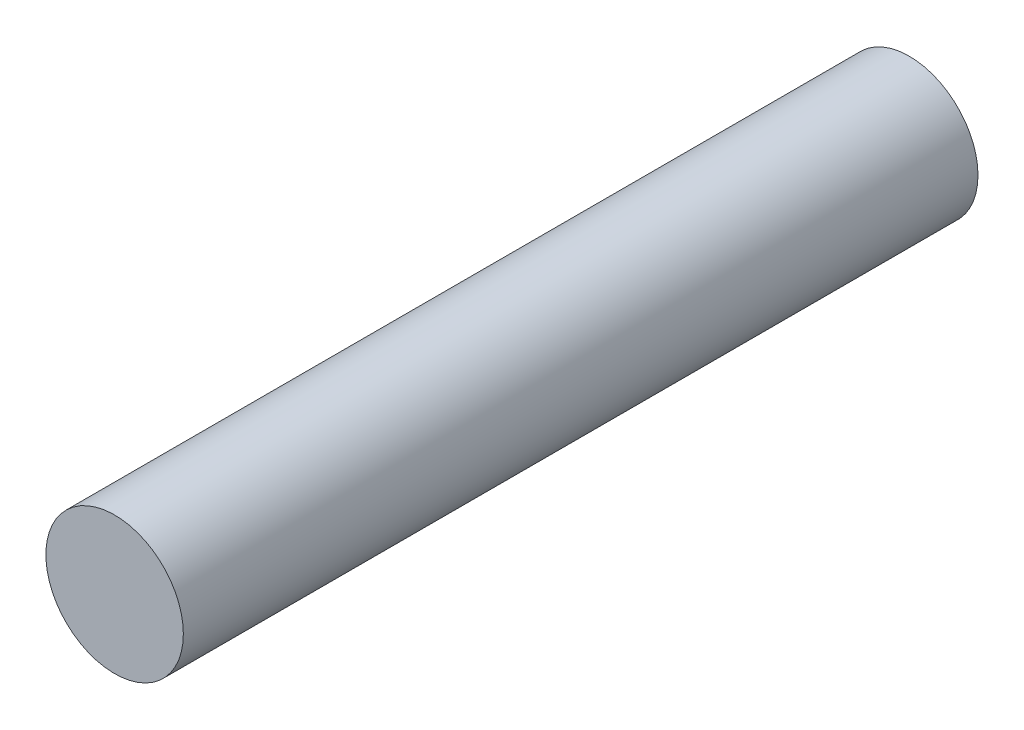
ISO-10303-21;
HEADER;
FILE_DESCRIPTION(('STEP AP214'),'2;1');
FILE_NAME('part.step','',(''),(''),'','','');
FILE_SCHEMA(('AUTOMOTIVE_DESIGN { 1 0 10303 214 1 1 1 1 }'));
ENDSEC;
DATA;
#1=APPLICATION_CONTEXT('core data for automotive mechanical design processes');
#2=APPLICATION_PROTOCOL_DEFINITION('international standard','automotive_design',2000,#1);
#3=PRODUCT_CONTEXT('',#1,'mechanical');
#4=PRODUCT('Part','Part','',(#3));
#5=PRODUCT_RELATED_PRODUCT_CATEGORY('part','',(#4));
#6=PRODUCT_DEFINITION_FORMATION('','',#4);
#7=PRODUCT_DEFINITION_CONTEXT('part definition',#1,'design');
#8=PRODUCT_DEFINITION('design','',#6,#7);
#9=PRODUCT_DEFINITION_SHAPE('','',#8);
#10=(LENGTH_UNIT() NAMED_UNIT(*) SI_UNIT(.MILLI.,.METRE.));
#11=(NAMED_UNIT(*) PLANE_ANGLE_UNIT() SI_UNIT($,.RADIAN.));
#12=(NAMED_UNIT(*) SI_UNIT($,.STERADIAN.) SOLID_ANGLE_UNIT());
#13=UNCERTAINTY_MEASURE_WITH_UNIT(LENGTH_MEASURE(1.E-05),#10,'distance_accuracy_value','');
#14=(GEOMETRIC_REPRESENTATION_CONTEXT(3) GLOBAL_UNCERTAINTY_ASSIGNED_CONTEXT((#13)) GLOBAL_UNIT_ASSIGNED_CONTEXT((#10,
#11,#12)) REPRESENTATION_CONTEXT('',''));
#15=CARTESIAN_POINT('',(0.,0.,0.));
#16=DIRECTION('',(0.,0.,1.));
#17=DIRECTION('',(1.,0.,0.));
#18=AXIS2_PLACEMENT_3D('',#15,#16,#17);
#19=CARTESIAN_POINT('',(-39.890553187095,50.7386048471501,9.));
#20=DIRECTION('',(0.,0.,-1.));
#21=DIRECTION('',(-1.,0.,0.));
#22=AXIS2_PLACEMENT_3D('',#19,#20,#21);
#23=CYLINDRICAL_SURFACE('',#22,4.06538173152769);
#24=CARTESIAN_POINT('',(-39.890553187095,50.7386048471501,9.));
#25=DIRECTION('',(0.,0.,1.));
#26=DIRECTION('',(1.,0.,0.));
#27=AXIS2_PLACEMENT_3D('',#24,#25,#26);
#28=CIRCLE('',#27,4.06538173152769);
#29=CARTESIAN_POINT('',(-35.8251714555673,50.7386048471501,9.));
#30=VERTEX_POINT('',#29);
#31=EDGE_CURVE('E10',#30,#30,#28,.T.);
#32=ORIENTED_EDGE('',*,*,#31,.F.);
#33=EDGE_LOOP('',(#32));
#34=FACE_BOUND('',#33,.T.);
#35=CARTESIAN_POINT('',(-39.890553187095,50.7386048471501,-38.));
#36=DIRECTION('',(0.,0.,1.));
#37=DIRECTION('',(1.,0.,0.));
#38=AXIS2_PLACEMENT_3D('',#35,#36,#37);
#39=CIRCLE('',#38,4.06538173152769);
#40=CARTESIAN_POINT('',(-35.8251714555673,50.7386048471501,-38.));
#41=VERTEX_POINT('',#40);
#42=EDGE_CURVE('E39',#41,#41,#39,.T.);
#43=ORIENTED_EDGE('',*,*,#42,.T.);
#44=EDGE_LOOP('',(#43));
#45=FACE_BOUND('',#44,.T.);
#46=ADVANCED_FACE('F33',(#34,#45),#23,.T.);
#47=CARTESIAN_POINT('',(-39.890553187095,50.7386048471501,9.));
#48=DIRECTION('',(0.,0.,1.));
#49=DIRECTION('',(1.,0.,0.));
#50=AXIS2_PLACEMENT_3D('',#47,#48,#49);
#51=PLANE('',#50);
#52=ORIENTED_EDGE('',*,*,#31,.T.);
#53=EDGE_LOOP('',(#52));
#54=FACE_BOUND('',#53,.T.);
#55=ADVANCED_FACE('F48',(#54),#51,.T.);
#56=CARTESIAN_POINT('',(-39.890553187095,50.7386048471501,-38.));
#57=DIRECTION('',(0.,0.,1.));
#58=DIRECTION('',(1.,0.,0.));
#59=AXIS2_PLACEMENT_3D('',#56,#57,#58);
#60=PLANE('',#59);
#61=ORIENTED_EDGE('',*,*,#42,.F.);
#62=EDGE_LOOP('',(#61));
#63=FACE_BOUND('',#62,.T.);
#64=ADVANCED_FACE('F46',(#63),#60,.F.);
#65=CLOSED_SHELL('',(#46,#55,#64));
#66=MANIFOLD_SOLID_BREP('B2',#65);
#67=ADVANCED_BREP_SHAPE_REPRESENTATION('',(#18,#66),#14);
#68=SHAPE_DEFINITION_REPRESENTATION(#9,#67);
ENDSEC;
END-ISO-10303-21;
